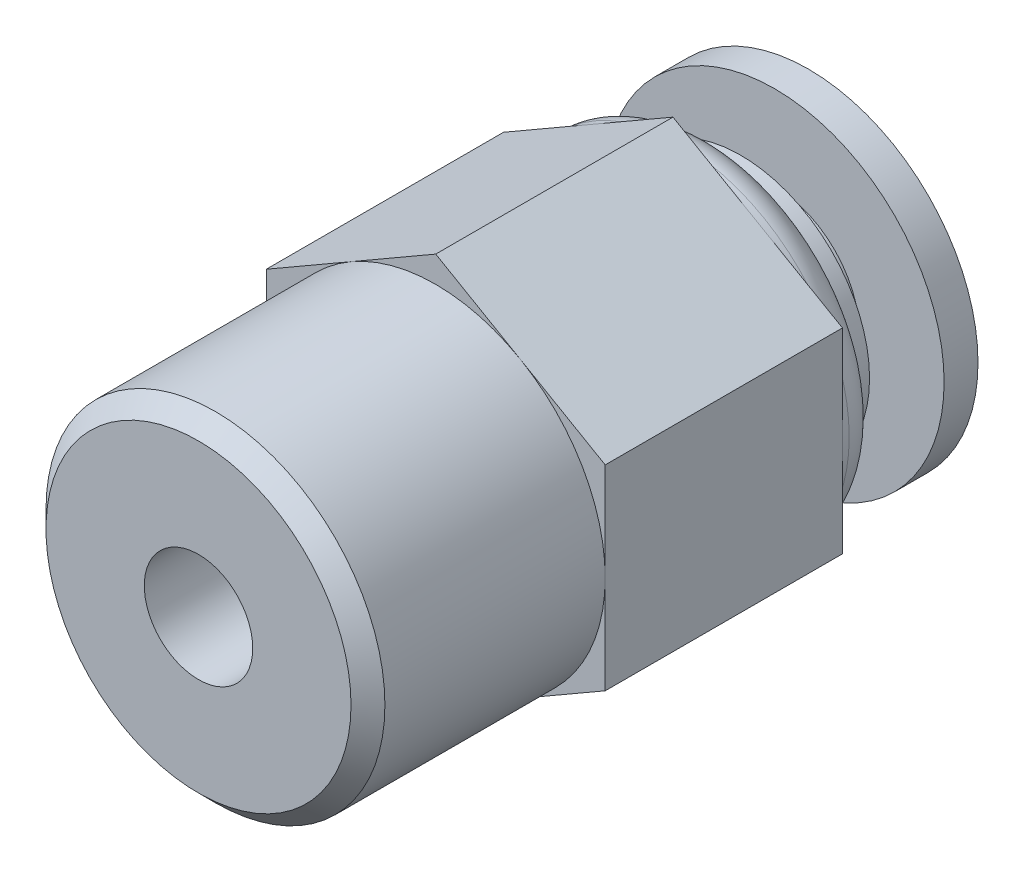
ISO-10303-21;
HEADER;
FILE_DESCRIPTION(('STEP AP214'),'2;1');
FILE_NAME('part.step','',(''),(''),'','','');
FILE_SCHEMA(('AUTOMOTIVE_DESIGN { 1 0 10303 214 1 1 1 1 }'));
ENDSEC;
DATA;
#1=APPLICATION_CONTEXT('core data for automotive mechanical design processes');
#2=APPLICATION_PROTOCOL_DEFINITION('international standard','automotive_design',2000,#1);
#3=PRODUCT_CONTEXT('',#1,'mechanical');
#4=PRODUCT('Part','Part','',(#3));
#5=PRODUCT_RELATED_PRODUCT_CATEGORY('part','',(#4));
#6=PRODUCT_DEFINITION_FORMATION('','',#4);
#7=PRODUCT_DEFINITION_CONTEXT('part definition',#1,'design');
#8=PRODUCT_DEFINITION('design','',#6,#7);
#9=PRODUCT_DEFINITION_SHAPE('','',#8);
#10=(LENGTH_UNIT() NAMED_UNIT(*) SI_UNIT(.MILLI.,.METRE.));
#11=(NAMED_UNIT(*) PLANE_ANGLE_UNIT() SI_UNIT($,.RADIAN.));
#12=(NAMED_UNIT(*) SI_UNIT($,.STERADIAN.) SOLID_ANGLE_UNIT());
#13=UNCERTAINTY_MEASURE_WITH_UNIT(LENGTH_MEASURE(1.E-05),#10,'distance_accuracy_value','');
#14=(GEOMETRIC_REPRESENTATION_CONTEXT(3) GLOBAL_UNCERTAINTY_ASSIGNED_CONTEXT((#13)) GLOBAL_UNIT_ASSIGNED_CONTEXT((#10,
#11,#12)) REPRESENTATION_CONTEXT('',''));
#15=CARTESIAN_POINT('',(0.,0.,0.));
#16=DIRECTION('',(0.,0.,1.));
#17=DIRECTION('',(1.,0.,0.));
#18=AXIS2_PLACEMENT_3D('',#15,#16,#17);
#19=CARTESIAN_POINT('',(0.,2.,-4.));
#20=DIRECTION('',(0.,0.,1.));
#21=DIRECTION('',(0.,-1.,0.));
#22=AXIS2_PLACEMENT_3D('',#19,#20,#21);
#23=PLANE('',#22);
#24=CARTESIAN_POINT('',(0.,0.,-4.));
#25=DIRECTION('',(0.,0.,1.));
#26=DIRECTION('',(0.,-1.,0.));
#27=AXIS2_PLACEMENT_3D('',#24,#25,#26);
#28=CIRCLE('',#27,5.);
#29=CARTESIAN_POINT('',(0.,-5.,-4.));
#30=VERTEX_POINT('',#29);
#31=EDGE_CURVE('E63',#30,#30,#28,.T.);
#32=ORIENTED_EDGE('',*,*,#31,.T.);
#33=EDGE_LOOP('',(#32));
#34=FACE_BOUND('',#33,.T.);
#35=CARTESIAN_POINT('',(0.,0.,-4.));
#36=DIRECTION('',(0.,0.,1.));
#37=DIRECTION('',(0.,-1.,0.));
#38=AXIS2_PLACEMENT_3D('',#35,#36,#37);
#39=CIRCLE('',#38,2.);
#40=CARTESIAN_POINT('',(0.,-2.,-4.));
#41=VERTEX_POINT('',#40);
#42=EDGE_CURVE('E47',#41,#41,#39,.T.);
#43=ORIENTED_EDGE('',*,*,#42,.F.);
#44=EDGE_LOOP('',(#43));
#45=FACE_BOUND('',#44,.T.);
#46=ADVANCED_FACE('F44',(#34,#45),#23,.T.);
#47=CARTESIAN_POINT('',(0.,0.,1.31728685876942));
#48=DIRECTION('',(0.,0.,1.));
#49=DIRECTION('',(0.,-1.,0.));
#50=AXIS2_PLACEMENT_3D('',#47,#48,#49);
#51=CYLINDRICAL_SURFACE('',#50,2.);
#52=ORIENTED_EDGE('',*,*,#42,.T.);
#53=EDGE_LOOP('',(#52));
#54=FACE_BOUND('',#53,.T.);
#55=CARTESIAN_POINT('',(0.,0.,5.));
#56=DIRECTION('',(0.,0.,1.));
#57=DIRECTION('',(0.,-1.,0.));
#58=AXIS2_PLACEMENT_3D('',#55,#56,#57);
#59=CIRCLE('',#58,2.);
#60=CARTESIAN_POINT('',(0.,-2.,5.));
#61=VERTEX_POINT('',#60);
#62=EDGE_CURVE('E61',#61,#61,#59,.T.);
#63=ORIENTED_EDGE('',*,*,#62,.F.);
#64=EDGE_LOOP('',(#63));
#65=FACE_BOUND('',#64,.T.);
#66=ADVANCED_FACE('F70',(#54,#65),#51,.T.);
#67=CARTESIAN_POINT('',(0.,2.5,5.));
#68=DIRECTION('',(0.,0.,-1.));
#69=DIRECTION('',(0.,1.,0.));
#70=AXIS2_PLACEMENT_3D('',#67,#68,#69);
#71=PLANE('',#70);
#72=ORIENTED_EDGE('',*,*,#62,.T.);
#73=EDGE_LOOP('',(#72));
#74=FACE_BOUND('',#73,.T.);
#75=CARTESIAN_POINT('',(0.,0.,5.));
#76=DIRECTION('',(0.,0.,1.));
#77=DIRECTION('',(0.,-1.,0.));
#78=AXIS2_PLACEMENT_3D('',#75,#76,#77);
#79=CIRCLE('',#78,2.5);
#80=CARTESIAN_POINT('',(0.,-2.5,5.));
#81=VERTEX_POINT('',#80);
#82=EDGE_CURVE('E56',#81,#81,#79,.T.);
#83=ORIENTED_EDGE('',*,*,#82,.F.);
#84=EDGE_LOOP('',(#83));
#85=FACE_BOUND('',#84,.T.);
#86=ADVANCED_FACE('F79',(#74,#85),#71,.T.);
#87=CARTESIAN_POINT('',(0.,0.,1.31728685876942));
#88=DIRECTION('',(0.,0.,1.));
#89=DIRECTION('',(0.,-1.,0.));
#90=AXIS2_PLACEMENT_3D('',#87,#88,#89);
#91=CYLINDRICAL_SURFACE('',#90,2.5);
#92=ORIENTED_EDGE('',*,*,#82,.T.);
#93=EDGE_LOOP('',(#92));
#94=FACE_BOUND('',#93,.T.);
#95=CARTESIAN_POINT('',(0.,0.,-3.));
#96=DIRECTION('',(0.,0.,1.));
#97=DIRECTION('',(0.,-1.,0.));
#98=AXIS2_PLACEMENT_3D('',#95,#96,#97);
#99=CIRCLE('',#98,2.5);
#100=CARTESIAN_POINT('',(0.,-2.5,-3.));
#101=VERTEX_POINT('',#100);
#102=EDGE_CURVE('E51',#101,#101,#99,.T.);
#103=ORIENTED_EDGE('',*,*,#102,.F.);
#104=EDGE_LOOP('',(#103));
#105=FACE_BOUND('',#104,.T.);
#106=ADVANCED_FACE('F86',(#94,#105),#91,.F.);
#107=CARTESIAN_POINT('',(0.,5.,-3.));
#108=DIRECTION('',(0.,0.,-1.));
#109=DIRECTION('',(0.,1.,0.));
#110=AXIS2_PLACEMENT_3D('',#107,#108,#109);
#111=PLANE('',#110);
#112=ORIENTED_EDGE('',*,*,#102,.T.);
#113=EDGE_LOOP('',(#112));
#114=FACE_BOUND('',#113,.T.);
#115=CARTESIAN_POINT('',(0.,0.,-3.));
#116=DIRECTION('',(0.,0.,1.));
#117=DIRECTION('',(0.,-1.,0.));
#118=AXIS2_PLACEMENT_3D('',#115,#116,#117);
#119=CIRCLE('',#118,5.);
#120=CARTESIAN_POINT('',(0.,-5.,-3.));
#121=VERTEX_POINT('',#120);
#122=EDGE_CURVE('E11',#121,#121,#119,.T.);
#123=ORIENTED_EDGE('',*,*,#122,.F.);
#124=EDGE_LOOP('',(#123));
#125=FACE_BOUND('',#124,.T.);
#126=ADVANCED_FACE('F82',(#114,#125),#111,.T.);
#127=CARTESIAN_POINT('',(0.,0.,1.31728685876942));
#128=DIRECTION('',(0.,0.,1.));
#129=DIRECTION('',(0.,-1.,0.));
#130=AXIS2_PLACEMENT_3D('',#127,#128,#129);
#131=CYLINDRICAL_SURFACE('',#130,5.);
#132=ORIENTED_EDGE('',*,*,#122,.T.);
#133=EDGE_LOOP('',(#132));
#134=FACE_BOUND('',#133,.T.);
#135=ORIENTED_EDGE('',*,*,#31,.F.);
#136=EDGE_LOOP('',(#135));
#137=FACE_BOUND('',#136,.T.);
#138=ADVANCED_FACE('F45',(#134,#137),#131,.F.);
#139=OPEN_SHELL('',(#46,#66,#86,#106,#126,#138));
#140=SHELL_BASED_SURFACE_MODEL('B2',(#139));
#141=CARTESIAN_POINT('',(0.,0.,-2.));
#142=DIRECTION('',(0.,0.,1.));
#143=DIRECTION('',(1.,0.,0.));
#144=AXIS2_PLACEMENT_3D('',#141,#142,#143);
#145=PLANE('',#144);
#146=CARTESIAN_POINT('',(0.,0.,-2.));
#147=DIRECTION('',(0.,0.,1.));
#148=DIRECTION('',(1.,0.,0.));
#149=AXIS2_PLACEMENT_3D('',#146,#147,#148);
#150=CIRCLE('',#149,3.8);
#151=CARTESIAN_POINT('',(3.8,0.,-2.));
#152=VERTEX_POINT('',#151);
#153=EDGE_CURVE('E312',#152,#152,#150,.T.);
#154=ORIENTED_EDGE('',*,*,#153,.F.);
#155=EDGE_LOOP('',(#154));
#156=FACE_BOUND('',#155,.T.);
#157=CARTESIAN_POINT('',(0.,0.,-2.));
#158=DIRECTION('',(0.,0.,1.));
#159=DIRECTION('',(1.,0.,0.));
#160=AXIS2_PLACEMENT_3D('',#157,#158,#159);
#161=CIRCLE('',#160,3.);
#162=CARTESIAN_POINT('',(3.,0.,-2.));
#163=VERTEX_POINT('',#162);
#164=EDGE_CURVE('E425',#163,#163,#161,.T.);
#165=ORIENTED_EDGE('',*,*,#164,.T.);
#166=EDGE_LOOP('',(#165));
#167=FACE_BOUND('',#166,.T.);
#168=ADVANCED_FACE('F135',(#156,#167),#145,.F.);
#169=CARTESIAN_POINT('',(0.,0.,14.));
#170=DIRECTION('',(0.,0.,1.));
#171=DIRECTION('',(1.,0.,0.));
#172=AXIS2_PLACEMENT_3D('',#169,#170,#171);
#173=PLANE('',#172);
#174=CARTESIAN_POINT('',(0.,0.,14.));
#175=DIRECTION('',(0.,0.,1.));
#176=DIRECTION('',(1.,0.,0.));
#177=AXIS2_PLACEMENT_3D('',#174,#175,#176);
#178=CIRCLE('',#177,4.49999999999999);
#179=CARTESIAN_POINT('',(4.49999999999999,0.,14.));
#180=VERTEX_POINT('',#179);
#181=EDGE_CURVE('E143',#180,#180,#178,.T.);
#182=ORIENTED_EDGE('',*,*,#181,.T.);
#183=EDGE_LOOP('',(#182));
#184=FACE_BOUND('',#183,.T.);
#185=CARTESIAN_POINT('',(0.,0.,14.));
#186=DIRECTION('',(0.,0.,1.));
#187=DIRECTION('',(1.,0.,0.));
#188=AXIS2_PLACEMENT_3D('',#185,#186,#187);
#189=CIRCLE('',#188,1.6);
#190=CARTESIAN_POINT('',(1.6,0.,14.));
#191=VERTEX_POINT('',#190);
#192=EDGE_CURVE('E322',#191,#191,#189,.T.);
#193=ORIENTED_EDGE('',*,*,#192,.F.);
#194=EDGE_LOOP('',(#193));
#195=FACE_BOUND('',#194,.T.);
#196=ADVANCED_FACE('F327',(#184,#195),#173,.T.);
#197=CARTESIAN_POINT('',(0.,0.,7.));
#198=DIRECTION('',(0.,0.,1.));
#199=DIRECTION('',(1.,0.,0.));
#200=AXIS2_PLACEMENT_3D('',#197,#198,#199);
#201=PLANE('',#200);
#202=DIRECTION('',(0.,1.,0.));
#203=VECTOR('',#202,1.);
#204=CARTESIAN_POINT('',(5.,-2.88675134594813,7.));
#205=LINE('',#204,#203);
#206=CARTESIAN_POINT('',(5.,-2.88675134594813,7.));
#207=VERTEX_POINT('',#206);
#208=CARTESIAN_POINT('',(5.,0.,7.));
#209=VERTEX_POINT('',#208);
#210=EDGE_CURVE('E269',#207,#209,#205,.T.);
#211=ORIENTED_EDGE('',*,*,#210,.T.);
#212=CARTESIAN_POINT('',(0.,0.,7.));
#213=DIRECTION('',(0.,0.,1.));
#214=DIRECTION('',(1.,0.,0.));
#215=AXIS2_PLACEMENT_3D('',#212,#213,#214);
#216=CIRCLE('',#215,5.);
#217=CARTESIAN_POINT('',(2.5,-4.33012701892219,7.));
#218=VERTEX_POINT('',#217);
#219=EDGE_CURVE('E150',#209,#218,#216,.F.);
#220=ORIENTED_EDGE('',*,*,#219,.T.);
#221=DIRECTION('',(0.866025403784438,0.5,0.));
#222=VECTOR('',#221,1.);
#223=CARTESIAN_POINT('',(0.,-5.77350269189626,7.));
#224=LINE('',#223,#222);
#225=EDGE_CURVE('E265',#218,#207,#224,.T.);
#226=ORIENTED_EDGE('',*,*,#225,.T.);
#227=EDGE_LOOP('',(#211,#220,#226));
#228=FACE_BOUND('',#227,.T.);
#229=ADVANCED_FACE('F346',(#228),#201,.T.);
#230=CARTESIAN_POINT('',(0.,-5.77350269189626,7.));
#231=VERTEX_POINT('',#230);
#232=EDGE_CURVE('E266',#231,#218,#224,.T.);
#233=ORIENTED_EDGE('',*,*,#232,.T.);
#234=CARTESIAN_POINT('',(-2.5,-4.3301270189222,7.));
#235=VERTEX_POINT('',#234);
#236=EDGE_CURVE('E616',#218,#235,#216,.F.);
#237=ORIENTED_EDGE('',*,*,#236,.T.);
#238=DIRECTION('',(0.866025403784438,-0.5,0.));
#239=VECTOR('',#238,1.);
#240=CARTESIAN_POINT('',(-5.,-2.88675134594813,7.));
#241=LINE('',#240,#239);
#242=EDGE_CURVE('E261',#235,#231,#241,.T.);
#243=ORIENTED_EDGE('',*,*,#242,.T.);
#244=EDGE_LOOP('',(#233,#237,#243));
#245=FACE_BOUND('',#244,.T.);
#246=ADVANCED_FACE('F373',(#245),#201,.T.);
#247=CARTESIAN_POINT('',(-5.,-2.88675134594813,7.));
#248=VERTEX_POINT('',#247);
#249=EDGE_CURVE('E262',#248,#235,#241,.T.);
#250=ORIENTED_EDGE('',*,*,#249,.T.);
#251=CARTESIAN_POINT('',(-5.,0.,7.));
#252=VERTEX_POINT('',#251);
#253=EDGE_CURVE('E639',#235,#252,#216,.F.);
#254=ORIENTED_EDGE('',*,*,#253,.T.);
#255=DIRECTION('',(0.,-1.,0.));
#256=VECTOR('',#255,1.);
#257=CARTESIAN_POINT('',(-5.,2.88675134594813,7.));
#258=LINE('',#257,#256);
#259=EDGE_CURVE('E257',#252,#248,#258,.T.);
#260=ORIENTED_EDGE('',*,*,#259,.T.);
#261=EDGE_LOOP('',(#250,#254,#260));
#262=FACE_BOUND('',#261,.T.);
#263=ADVANCED_FACE('F532',(#262),#201,.T.);
#264=CARTESIAN_POINT('',(-5.,2.88675134594813,7.));
#265=VERTEX_POINT('',#264);
#266=EDGE_CURVE('E258',#265,#252,#258,.T.);
#267=ORIENTED_EDGE('',*,*,#266,.T.);
#268=CARTESIAN_POINT('',(-2.5,4.3301270189222,7.));
#269=VERTEX_POINT('',#268);
#270=EDGE_CURVE('E238',#252,#269,#216,.F.);
#271=ORIENTED_EDGE('',*,*,#270,.T.);
#272=DIRECTION('',(-0.866025403784438,-0.5,0.));
#273=VECTOR('',#272,1.);
#274=CARTESIAN_POINT('',(0.,5.77350269189626,7.));
#275=LINE('',#274,#273);
#276=EDGE_CURVE('E253',#269,#265,#275,.T.);
#277=ORIENTED_EDGE('',*,*,#276,.T.);
#278=EDGE_LOOP('',(#267,#271,#277));
#279=FACE_BOUND('',#278,.T.);
#280=ADVANCED_FACE('F525',(#279),#201,.T.);
#281=CARTESIAN_POINT('',(0.,5.77350269189626,7.));
#282=VERTEX_POINT('',#281);
#283=EDGE_CURVE('E237',#282,#269,#275,.T.);
#284=ORIENTED_EDGE('',*,*,#283,.T.);
#285=CARTESIAN_POINT('',(2.5,4.3301270189222,7.));
#286=VERTEX_POINT('',#285);
#287=EDGE_CURVE('E224',#269,#286,#216,.F.);
#288=ORIENTED_EDGE('',*,*,#287,.T.);
#289=DIRECTION('',(-0.866025403784439,0.5,0.));
#290=VECTOR('',#289,1.);
#291=CARTESIAN_POINT('',(5.,2.88675134594813,7.));
#292=LINE('',#291,#290);
#293=EDGE_CURVE('E235',#286,#282,#292,.T.);
#294=ORIENTED_EDGE('',*,*,#293,.T.);
#295=EDGE_LOOP('',(#284,#288,#294));
#296=FACE_BOUND('',#295,.T.);
#297=ADVANCED_FACE('F234',(#296),#201,.T.);
#298=CARTESIAN_POINT('',(5.,2.88675134594813,7.));
#299=VERTEX_POINT('',#298);
#300=EDGE_CURVE('E245',#299,#286,#292,.T.);
#301=ORIENTED_EDGE('',*,*,#300,.T.);
#302=EDGE_CURVE('E221',#286,#209,#216,.F.);
#303=ORIENTED_EDGE('',*,*,#302,.T.);
#304=EDGE_CURVE('E251',#209,#299,#205,.T.);
#305=ORIENTED_EDGE('',*,*,#304,.T.);
#306=EDGE_LOOP('',(#301,#303,#305));
#307=FACE_BOUND('',#306,.T.);
#308=ADVANCED_FACE('F250',(#307),#201,.T.);
#309=CARTESIAN_POINT('',(0.,0.,0.));
#310=DIRECTION('',(0.,0.,1.));
#311=DIRECTION('',(1.,0.,0.));
#312=AXIS2_PLACEMENT_3D('',#309,#310,#311);
#313=PLANE('',#312);
#314=DIRECTION('',(0.,1.,0.));
#315=VECTOR('',#314,1.);
#316=CARTESIAN_POINT('',(5.,-2.88675134594813,0.));
#317=LINE('',#316,#315);
#318=CARTESIAN_POINT('',(5.,0.,0.));
#319=VERTEX_POINT('',#318);
#320=CARTESIAN_POINT('',(5.,2.88675134594813,0.));
#321=VERTEX_POINT('',#320);
#322=EDGE_CURVE('E292',#319,#321,#317,.T.);
#323=ORIENTED_EDGE('',*,*,#322,.F.);
#324=CARTESIAN_POINT('',(0.,0.,0.));
#325=DIRECTION('',(0.,0.,1.));
#326=DIRECTION('',(1.,0.,0.));
#327=AXIS2_PLACEMENT_3D('',#324,#325,#326);
#328=CIRCLE('',#327,5.);
#329=CARTESIAN_POINT('',(2.5,4.33012701892219,0.));
#330=VERTEX_POINT('',#329);
#331=EDGE_CURVE('E158',#319,#330,#328,.T.);
#332=ORIENTED_EDGE('',*,*,#331,.T.);
#333=DIRECTION('',(-0.866025403784439,0.5,0.));
#334=VECTOR('',#333,1.);
#335=CARTESIAN_POINT('',(5.,2.88675134594813,0.));
#336=LINE('',#335,#334);
#337=EDGE_CURVE('E273',#321,#330,#336,.T.);
#338=ORIENTED_EDGE('',*,*,#337,.F.);
#339=EDGE_LOOP('',(#323,#332,#338));
#340=FACE_BOUND('',#339,.T.);
#341=ADVANCED_FACE('F379',(#340),#313,.F.);
#342=CARTESIAN_POINT('',(0.,5.77350269189626,0.));
#343=VERTEX_POINT('',#342);
#344=EDGE_CURVE('E276',#330,#343,#336,.T.);
#345=ORIENTED_EDGE('',*,*,#344,.F.);
#346=CARTESIAN_POINT('',(-2.5,4.33012701892219,0.));
#347=VERTEX_POINT('',#346);
#348=EDGE_CURVE('E317',#330,#347,#328,.T.);
#349=ORIENTED_EDGE('',*,*,#348,.T.);
#350=DIRECTION('',(-0.866025403784438,-0.5,0.));
#351=VECTOR('',#350,1.);
#352=CARTESIAN_POINT('',(0.,5.77350269189626,0.));
#353=LINE('',#352,#351);
#354=EDGE_CURVE('E277',#343,#347,#353,.T.);
#355=ORIENTED_EDGE('',*,*,#354,.F.);
#356=EDGE_LOOP('',(#345,#349,#355));
#357=FACE_BOUND('',#356,.T.);
#358=ADVANCED_FACE('F582',(#357),#313,.F.);
#359=CARTESIAN_POINT('',(-5.,2.88675134594813,0.));
#360=VERTEX_POINT('',#359);
#361=EDGE_CURVE('E275',#347,#360,#353,.T.);
#362=ORIENTED_EDGE('',*,*,#361,.F.);
#363=CARTESIAN_POINT('',(-5.,0.,0.));
#364=VERTEX_POINT('',#363);
#365=EDGE_CURVE('E618',#347,#364,#328,.T.);
#366=ORIENTED_EDGE('',*,*,#365,.T.);
#367=DIRECTION('',(0.,-1.,0.));
#368=VECTOR('',#367,1.);
#369=CARTESIAN_POINT('',(-5.,2.88675134594813,0.));
#370=LINE('',#369,#368);
#371=EDGE_CURVE('E281',#360,#364,#370,.T.);
#372=ORIENTED_EDGE('',*,*,#371,.F.);
#373=EDGE_LOOP('',(#362,#366,#372));
#374=FACE_BOUND('',#373,.T.);
#375=ADVANCED_FACE('F573',(#374),#313,.F.);
#376=CARTESIAN_POINT('',(-5.,-2.88675134594813,0.));
#377=VERTEX_POINT('',#376);
#378=EDGE_CURVE('E280',#364,#377,#370,.T.);
#379=ORIENTED_EDGE('',*,*,#378,.F.);
#380=CARTESIAN_POINT('',(-2.5,-4.33012701892219,0.));
#381=VERTEX_POINT('',#380);
#382=EDGE_CURVE('E615',#364,#381,#328,.T.);
#383=ORIENTED_EDGE('',*,*,#382,.T.);
#384=DIRECTION('',(0.866025403784438,-0.5,0.));
#385=VECTOR('',#384,1.);
#386=CARTESIAN_POINT('',(-5.,-2.88675134594813,0.));
#387=LINE('',#386,#385);
#388=EDGE_CURVE('E285',#377,#381,#387,.T.);
#389=ORIENTED_EDGE('',*,*,#388,.F.);
#390=EDGE_LOOP('',(#379,#383,#389));
#391=FACE_BOUND('',#390,.T.);
#392=ADVANCED_FACE('F564',(#391),#313,.F.);
#393=CARTESIAN_POINT('',(0.,-5.77350269189626,0.));
#394=VERTEX_POINT('',#393);
#395=EDGE_CURVE('E284',#381,#394,#387,.T.);
#396=ORIENTED_EDGE('',*,*,#395,.F.);
#397=CARTESIAN_POINT('',(2.5,-4.33012701892219,0.));
#398=VERTEX_POINT('',#397);
#399=EDGE_CURVE('E614',#381,#398,#328,.T.);
#400=ORIENTED_EDGE('',*,*,#399,.T.);
#401=DIRECTION('',(0.866025403784438,0.5,0.));
#402=VECTOR('',#401,1.);
#403=CARTESIAN_POINT('',(0.,-5.77350269189626,0.));
#404=LINE('',#403,#402);
#405=EDGE_CURVE('E289',#394,#398,#404,.T.);
#406=ORIENTED_EDGE('',*,*,#405,.F.);
#407=EDGE_LOOP('',(#396,#400,#406));
#408=FACE_BOUND('',#407,.T.);
#409=ADVANCED_FACE('F380',(#408),#313,.F.);
#410=CARTESIAN_POINT('',(5.,2.88675134594813,7.));
#411=DIRECTION('',(-0.5,-0.866025403784439,0.));
#412=DIRECTION('',(0.866025403784439,-0.5,0.));
#413=AXIS2_PLACEMENT_3D('',#410,#411,#412);
#414=PLANE('',#413);
#415=ORIENTED_EDGE('',*,*,#337,.T.);
#416=ORIENTED_EDGE('',*,*,#344,.T.);
#417=DIRECTION('',(0.,0.,-1.));
#418=VECTOR('',#417,1.);
#419=CARTESIAN_POINT('',(0.,5.77350269189626,7.));
#420=LINE('',#419,#418);
#421=EDGE_CURVE('E247',#282,#343,#420,.T.);
#422=ORIENTED_EDGE('',*,*,#421,.F.);
#423=ORIENTED_EDGE('',*,*,#293,.F.);
#424=ORIENTED_EDGE('',*,*,#300,.F.);
#425=DIRECTION('',(0.,0.,-1.));
#426=VECTOR('',#425,1.);
#427=CARTESIAN_POINT('',(5.,2.88675134594813,7.));
#428=LINE('',#427,#426);
#429=EDGE_CURVE('E272',#299,#321,#428,.T.);
#430=ORIENTED_EDGE('',*,*,#429,.T.);
#431=EDGE_LOOP('',(#415,#416,#422,#423,#424,#430));
#432=FACE_BOUND('',#431,.T.);
#433=ADVANCED_FACE('F243',(#432),#414,.F.);
#434=CARTESIAN_POINT('',(0.,5.77350269189626,7.));
#435=DIRECTION('',(0.5,-0.866025403784438,0.));
#436=DIRECTION('',(0.866025403784439,0.5,0.));
#437=AXIS2_PLACEMENT_3D('',#434,#435,#436);
#438=PLANE('',#437);
#439=ORIENTED_EDGE('',*,*,#354,.T.);
#440=ORIENTED_EDGE('',*,*,#361,.T.);
#441=DIRECTION('',(0.,0.,-1.));
#442=VECTOR('',#441,1.);
#443=CARTESIAN_POINT('',(-5.,2.88675134594813,7.));
#444=LINE('',#443,#442);
#445=EDGE_CURVE('E305',#265,#360,#444,.T.);
#446=ORIENTED_EDGE('',*,*,#445,.F.);
#447=ORIENTED_EDGE('',*,*,#276,.F.);
#448=ORIENTED_EDGE('',*,*,#283,.F.);
#449=ORIENTED_EDGE('',*,*,#421,.T.);
#450=EDGE_LOOP('',(#439,#440,#446,#447,#448,#449));
#451=FACE_BOUND('',#450,.T.);
#452=ADVANCED_FACE('F395',(#451),#438,.F.);
#453=CARTESIAN_POINT('',(-5.,2.88675134594813,7.));
#454=DIRECTION('',(1.,0.,0.));
#455=DIRECTION('',(0.,1.,0.));
#456=AXIS2_PLACEMENT_3D('',#453,#454,#455);
#457=PLANE('',#456);
#458=ORIENTED_EDGE('',*,*,#371,.T.);
#459=ORIENTED_EDGE('',*,*,#378,.T.);
#460=DIRECTION('',(0.,0.,-1.));
#461=VECTOR('',#460,1.);
#462=CARTESIAN_POINT('',(-5.,-2.88675134594813,7.));
#463=LINE('',#462,#461);
#464=EDGE_CURVE('E302',#248,#377,#463,.T.);
#465=ORIENTED_EDGE('',*,*,#464,.F.);
#466=ORIENTED_EDGE('',*,*,#259,.F.);
#467=ORIENTED_EDGE('',*,*,#266,.F.);
#468=ORIENTED_EDGE('',*,*,#445,.T.);
#469=EDGE_LOOP('',(#458,#459,#465,#466,#467,#468));
#470=FACE_BOUND('',#469,.T.);
#471=ADVANCED_FACE('F391',(#470),#457,.F.);
#472=CARTESIAN_POINT('',(-5.,-2.88675134594813,7.));
#473=DIRECTION('',(0.5,0.866025403784438,0.));
#474=DIRECTION('',(-0.866025403784438,0.5,0.));
#475=AXIS2_PLACEMENT_3D('',#472,#473,#474);
#476=PLANE('',#475);
#477=ORIENTED_EDGE('',*,*,#388,.T.);
#478=ORIENTED_EDGE('',*,*,#395,.T.);
#479=DIRECTION('',(0.,0.,-1.));
#480=VECTOR('',#479,1.);
#481=CARTESIAN_POINT('',(0.,-5.77350269189626,7.));
#482=LINE('',#481,#480);
#483=EDGE_CURVE('E299',#231,#394,#482,.T.);
#484=ORIENTED_EDGE('',*,*,#483,.F.);
#485=ORIENTED_EDGE('',*,*,#242,.F.);
#486=ORIENTED_EDGE('',*,*,#249,.F.);
#487=ORIENTED_EDGE('',*,*,#464,.T.);
#488=EDGE_LOOP('',(#477,#478,#484,#485,#486,#487));
#489=FACE_BOUND('',#488,.T.);
#490=ADVANCED_FACE('F387',(#489),#476,.F.);
#491=CARTESIAN_POINT('',(0.,-5.77350269189626,7.));
#492=DIRECTION('',(-0.5,0.866025403784439,0.));
#493=DIRECTION('',(-0.866025403784439,-0.5,0.));
#494=AXIS2_PLACEMENT_3D('',#491,#492,#493);
#495=PLANE('',#494);
#496=ORIENTED_EDGE('',*,*,#405,.T.);
#497=CARTESIAN_POINT('',(5.,-2.88675134594813,0.));
#498=VERTEX_POINT('',#497);
#499=EDGE_CURVE('E288',#398,#498,#404,.T.);
#500=ORIENTED_EDGE('',*,*,#499,.T.);
#501=DIRECTION('',(0.,0.,-1.));
#502=VECTOR('',#501,1.);
#503=CARTESIAN_POINT('',(5.,-2.88675134594813,7.));
#504=LINE('',#503,#502);
#505=EDGE_CURVE('E296',#207,#498,#504,.T.);
#506=ORIENTED_EDGE('',*,*,#505,.F.);
#507=ORIENTED_EDGE('',*,*,#225,.F.);
#508=ORIENTED_EDGE('',*,*,#232,.F.);
#509=ORIENTED_EDGE('',*,*,#483,.T.);
#510=EDGE_LOOP('',(#496,#500,#506,#507,#508,#509));
#511=FACE_BOUND('',#510,.T.);
#512=ADVANCED_FACE('F383',(#511),#495,.F.);
#513=CARTESIAN_POINT('',(5.,-2.88675134594813,7.));
#514=DIRECTION('',(-1.,0.,0.));
#515=DIRECTION('',(0.,0.,1.));
#516=AXIS2_PLACEMENT_3D('',#513,#514,#515);
#517=PLANE('',#516);
#518=EDGE_CURVE('E248',#498,#319,#317,.T.);
#519=ORIENTED_EDGE('',*,*,#518,.T.);
#520=ORIENTED_EDGE('',*,*,#322,.T.);
#521=ORIENTED_EDGE('',*,*,#429,.F.);
#522=ORIENTED_EDGE('',*,*,#304,.F.);
#523=ORIENTED_EDGE('',*,*,#210,.F.);
#524=ORIENTED_EDGE('',*,*,#505,.T.);
#525=EDGE_LOOP('',(#519,#520,#521,#522,#523,#524));
#526=FACE_BOUND('',#525,.T.);
#527=ADVANCED_FACE('F377',(#526),#517,.F.);
#528=ORIENTED_EDGE('',*,*,#499,.F.);
#529=EDGE_CURVE('E309',#398,#319,#328,.T.);
#530=ORIENTED_EDGE('',*,*,#529,.T.);
#531=ORIENTED_EDGE('',*,*,#518,.F.);
#532=EDGE_LOOP('',(#528,#530,#531));
#533=FACE_BOUND('',#532,.T.);
#534=ADVANCED_FACE('F369',(#533),#313,.F.);
#535=CARTESIAN_POINT('',(0.,0.,-1.2));
#536=DIRECTION('',(0.,0.,1.));
#537=DIRECTION('',(1.,0.,0.));
#538=AXIS2_PLACEMENT_3D('',#535,#536,#537);
#539=CYLINDRICAL_SURFACE('',#538,5.);
#540=CARTESIAN_POINT('',(0.,0.,-0.2));
#541=DIRECTION('',(0.,0.,1.));
#542=DIRECTION('',(1.,0.,0.));
#543=AXIS2_PLACEMENT_3D('',#540,#541,#542);
#544=CIRCLE('',#543,5.);
#545=CARTESIAN_POINT('',(5.,0.,-0.2));
#546=VERTEX_POINT('',#545);
#547=EDGE_CURVE('E313',#546,#546,#544,.T.);
#548=ORIENTED_EDGE('',*,*,#547,.T.);
#549=EDGE_LOOP('',(#548));
#550=FACE_BOUND('',#549,.T.);
#551=ORIENTED_EDGE('',*,*,#331,.F.);
#552=ORIENTED_EDGE('',*,*,#529,.F.);
#553=ORIENTED_EDGE('',*,*,#399,.F.);
#554=ORIENTED_EDGE('',*,*,#382,.F.);
#555=ORIENTED_EDGE('',*,*,#365,.F.);
#556=ORIENTED_EDGE('',*,*,#348,.F.);
#557=EDGE_LOOP('',(#551,#552,#553,#554,#555,#556));
#558=FACE_BOUND('',#557,.T.);
#559=ADVANCED_FACE('F365',(#550,#558),#539,.T.);
#560=CARTESIAN_POINT('',(0.,0.,-1.2));
#561=DIRECTION('',(0.,0.,1.));
#562=DIRECTION('',(1.,0.,0.));
#563=AXIS2_PLACEMENT_3D('',#560,#561,#562);
#564=PLANE('',#563);
#565=CARTESIAN_POINT('',(0.,0.,-1.2));
#566=DIRECTION('',(0.,0.,1.));
#567=DIRECTION('',(1.,0.,0.));
#568=AXIS2_PLACEMENT_3D('',#565,#566,#567);
#569=CIRCLE('',#568,4.);
#570=CARTESIAN_POINT('',(4.,0.,-1.2));
#571=VERTEX_POINT('',#570);
#572=EDGE_CURVE('E316',#571,#571,#569,.F.);
#573=ORIENTED_EDGE('',*,*,#572,.T.);
#574=EDGE_LOOP('',(#573));
#575=FACE_BOUND('',#574,.T.);
#576=CARTESIAN_POINT('',(0.,0.,-1.2));
#577=DIRECTION('',(0.,0.,1.));
#578=DIRECTION('',(1.,0.,0.));
#579=AXIS2_PLACEMENT_3D('',#576,#577,#578);
#580=CIRCLE('',#579,3.8);
#581=CARTESIAN_POINT('',(3.8,0.,-1.2));
#582=VERTEX_POINT('',#581);
#583=EDGE_CURVE('E229',#582,#582,#580,.T.);
#584=ORIENTED_EDGE('',*,*,#583,.T.);
#585=EDGE_LOOP('',(#584));
#586=FACE_BOUND('',#585,.T.);
#587=ADVANCED_FACE('F361',(#575,#586),#564,.F.);
#588=CARTESIAN_POINT('',(0.,0.,14.));
#589=DIRECTION('',(0.,0.,-1.));
#590=DIRECTION('',(-1.,0.,0.));
#591=AXIS2_PLACEMENT_3D('',#588,#589,#590);
#592=CYLINDRICAL_SURFACE('',#591,5.);
#593=CARTESIAN_POINT('',(0.,0.,13.5));
#594=DIRECTION('',(0.,0.,1.));
#595=DIRECTION('',(1.,0.,0.));
#596=AXIS2_PLACEMENT_3D('',#593,#594,#595);
#597=CIRCLE('',#596,5.);
#598=CARTESIAN_POINT('',(5.,0.,13.5));
#599=VERTEX_POINT('',#598);
#600=EDGE_CURVE('E42',#599,#599,#597,.F.);
#601=ORIENTED_EDGE('',*,*,#600,.T.);
#602=EDGE_LOOP('',(#601));
#603=FACE_BOUND('',#602,.T.);
#604=ORIENTED_EDGE('',*,*,#219,.F.);
#605=ORIENTED_EDGE('',*,*,#302,.F.);
#606=ORIENTED_EDGE('',*,*,#287,.F.);
#607=ORIENTED_EDGE('',*,*,#270,.F.);
#608=ORIENTED_EDGE('',*,*,#253,.F.);
#609=ORIENTED_EDGE('',*,*,#236,.F.);
#610=EDGE_LOOP('',(#604,#605,#606,#607,#608,#609));
#611=FACE_BOUND('',#610,.T.);
#612=ADVANCED_FACE('F223',(#603,#611),#592,.T.);
#613=CARTESIAN_POINT('',(0.,0.,-2.));
#614=DIRECTION('',(0.,0.,1.));
#615=DIRECTION('',(1.,0.,0.));
#616=AXIS2_PLACEMENT_3D('',#613,#614,#615);
#617=CYLINDRICAL_SURFACE('',#616,3.8);
#618=ORIENTED_EDGE('',*,*,#153,.T.);
#619=EDGE_LOOP('',(#618));
#620=FACE_BOUND('',#619,.T.);
#621=ORIENTED_EDGE('',*,*,#583,.F.);
#622=EDGE_LOOP('',(#621));
#623=FACE_BOUND('',#622,.T.);
#624=ADVANCED_FACE('F354',(#620,#623),#617,.T.);
#625=CARTESIAN_POINT('',(0.,0.,-0.2));
#626=DIRECTION('',(0.,0.,1.));
#627=DIRECTION('',(1.,0.,0.));
#628=AXIS2_PLACEMENT_3D('',#625,#626,#627);
#629=TOROIDAL_SURFACE('',#628,4.,1.);
#630=ORIENTED_EDGE('',*,*,#572,.F.);
#631=EDGE_LOOP('',(#630));
#632=FACE_BOUND('',#631,.T.);
#633=ORIENTED_EDGE('',*,*,#547,.F.);
#634=EDGE_LOOP('',(#633));
#635=FACE_BOUND('',#634,.T.);
#636=ADVANCED_FACE('F356',(#632,#635),#629,.T.);
#637=CARTESIAN_POINT('',(0.,0.,14.));
#638=DIRECTION('',(0.,0.,-1.));
#639=DIRECTION('',(-1.,0.,0.));
#640=AXIS2_PLACEMENT_3D('',#637,#638,#639);
#641=CYLINDRICAL_SURFACE('',#640,1.6);
#642=CARTESIAN_POINT('',(0.,0.,5.));
#643=DIRECTION('',(0.,0.,1.));
#644=DIRECTION('',(1.,0.,0.));
#645=AXIS2_PLACEMENT_3D('',#642,#643,#644);
#646=CIRCLE('',#645,1.6);
#647=CARTESIAN_POINT('',(1.6,0.,5.));
#648=VERTEX_POINT('',#647);
#649=EDGE_CURVE('E320',#648,#648,#646,.T.);
#650=ORIENTED_EDGE('',*,*,#649,.F.);
#651=EDGE_LOOP('',(#650));
#652=FACE_BOUND('',#651,.T.);
#653=ORIENTED_EDGE('',*,*,#192,.T.);
#654=EDGE_LOOP('',(#653));
#655=FACE_BOUND('',#654,.T.);
#656=ADVANCED_FACE('F352',(#652,#655),#641,.F.);
#657=CARTESIAN_POINT('',(0.,0.,5.));
#658=DIRECTION('',(0.,0.,-1.));
#659=DIRECTION('',(-1.,0.,0.));
#660=AXIS2_PLACEMENT_3D('',#657,#658,#659);
#661=CYLINDRICAL_SURFACE('',#660,3.);
#662=CARTESIAN_POINT('',(0.,0.,5.));
#663=DIRECTION('',(0.,0.,1.));
#664=DIRECTION('',(1.,0.,0.));
#665=AXIS2_PLACEMENT_3D('',#662,#663,#664);
#666=CIRCLE('',#665,3.);
#667=CARTESIAN_POINT('',(3.,0.,5.));
#668=VERTEX_POINT('',#667);
#669=EDGE_CURVE('E323',#668,#668,#666,.T.);
#670=ORIENTED_EDGE('',*,*,#669,.T.);
#671=EDGE_LOOP('',(#670));
#672=FACE_BOUND('',#671,.T.);
#673=ORIENTED_EDGE('',*,*,#164,.F.);
#674=EDGE_LOOP('',(#673));
#675=FACE_BOUND('',#674,.T.);
#676=ADVANCED_FACE('F336',(#672,#675),#661,.F.);
#677=CARTESIAN_POINT('',(0.,0.,5.));
#678=DIRECTION('',(0.,0.,1.));
#679=DIRECTION('',(1.,0.,0.));
#680=AXIS2_PLACEMENT_3D('',#677,#678,#679);
#681=PLANE('',#680);
#682=ORIENTED_EDGE('',*,*,#649,.T.);
#683=EDGE_LOOP('',(#682));
#684=FACE_BOUND('',#683,.T.);
#685=ORIENTED_EDGE('',*,*,#669,.F.);
#686=EDGE_LOOP('',(#685));
#687=FACE_BOUND('',#686,.T.);
#688=ADVANCED_FACE('F331',(#684,#687),#681,.F.);
#689=CARTESIAN_POINT('',(0.,0.,14.));
#690=DIRECTION('',(0.,0.,-1.));
#691=DIRECTION('',(-1.,0.,0.));
#692=AXIS2_PLACEMENT_3D('',#689,#690,#691);
#693=CONICAL_SURFACE('',#692,4.49999999999999,0.785398163397446);
#694=ORIENTED_EDGE('',*,*,#600,.F.);
#695=EDGE_LOOP('',(#694));
#696=FACE_BOUND('',#695,.T.);
#697=ORIENTED_EDGE('',*,*,#181,.F.);
#698=EDGE_LOOP('',(#697));
#699=FACE_BOUND('',#698,.T.);
#700=ADVANCED_FACE('F137',(#696,#699),#693,.T.);
#701=CLOSED_SHELL('',(#168,#196,#229,#246,#263,#280,#297,#308,#341,#358,#375,#392,#409,#433,
#452,#471,#490,#512,#527,#534,#559,#587,#612,#624,#636,#656,#676,#688,#700));
#702=MANIFOLD_SOLID_BREP('B6',#701);
#703=ADVANCED_BREP_SHAPE_REPRESENTATION('',(#18,#702),#14);
#704=MANIFOLD_SURFACE_SHAPE_REPRESENTATION('',(#18,#140),#14);
#705=SHAPE_REPRESENTATION('',(#18),#14);
#706=SHAPE_DEFINITION_REPRESENTATION(#9,#705);
#707=SHAPE_REPRESENTATION_RELATIONSHIP('','',#705,#703);
#708=SHAPE_REPRESENTATION_RELATIONSHIP('','',#705,#704);
ENDSEC;
END-ISO-10303-21;
